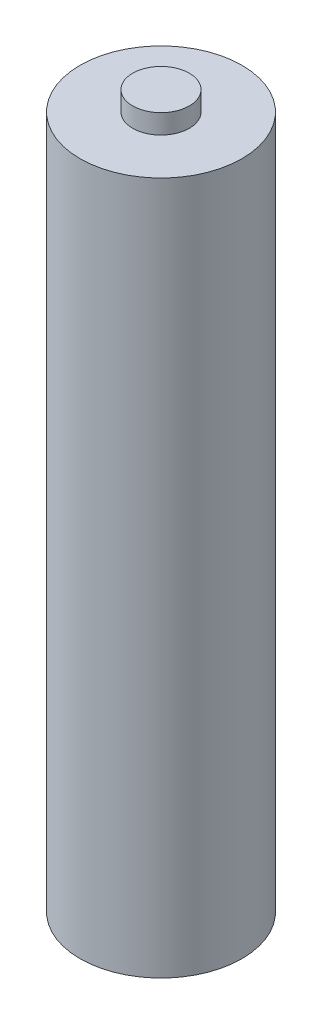
ISO-10303-21;
HEADER;
FILE_DESCRIPTION(('STEP AP214'),'2;1');
FILE_NAME('part.step','',(''),(''),'','','');
FILE_SCHEMA(('AUTOMOTIVE_DESIGN { 1 0 10303 214 1 1 1 1 }'));
ENDSEC;
DATA;
#1=APPLICATION_CONTEXT('core data for automotive mechanical design processes');
#2=APPLICATION_PROTOCOL_DEFINITION('international standard','automotive_design',2000,#1);
#3=PRODUCT_CONTEXT('',#1,'mechanical');
#4=PRODUCT('Part','Part','',(#3));
#5=PRODUCT_RELATED_PRODUCT_CATEGORY('part','',(#4));
#6=PRODUCT_DEFINITION_FORMATION('','',#4);
#7=PRODUCT_DEFINITION_CONTEXT('part definition',#1,'design');
#8=PRODUCT_DEFINITION('design','',#6,#7);
#9=PRODUCT_DEFINITION_SHAPE('','',#8);
#10=(LENGTH_UNIT() NAMED_UNIT(*) SI_UNIT(.MILLI.,.METRE.));
#11=(NAMED_UNIT(*) PLANE_ANGLE_UNIT() SI_UNIT($,.RADIAN.));
#12=(NAMED_UNIT(*) SI_UNIT($,.STERADIAN.) SOLID_ANGLE_UNIT());
#13=UNCERTAINTY_MEASURE_WITH_UNIT(LENGTH_MEASURE(1.E-05),#10,'distance_accuracy_value','');
#14=(GEOMETRIC_REPRESENTATION_CONTEXT(3) GLOBAL_UNCERTAINTY_ASSIGNED_CONTEXT((#13)) GLOBAL_UNIT_ASSIGNED_CONTEXT((#10,
#11,#12)) REPRESENTATION_CONTEXT('',''));
#15=CARTESIAN_POINT('',(0.,0.,0.));
#16=DIRECTION('',(0.,0.,1.));
#17=DIRECTION('',(1.,0.,0.));
#18=AXIS2_PLACEMENT_3D('',#15,#16,#17);
#19=CARTESIAN_POINT('',(0.,0.,0.));
#20=DIRECTION('',(0.,1.,0.));
#21=DIRECTION('',(0.,0.,1.));
#22=AXIS2_PLACEMENT_3D('',#19,#20,#21);
#23=PLANE('',#22);
#24=CARTESIAN_POINT('',(0.,0.,0.));
#25=DIRECTION('',(0.,1.,0.));
#26=DIRECTION('',(0.,0.,1.));
#27=AXIS2_PLACEMENT_3D('',#24,#25,#26);
#28=CIRCLE('',#27,1.75);
#29=CARTESIAN_POINT('',(0.,0.,1.75));
#30=VERTEX_POINT('',#29);
#31=EDGE_CURVE('E10',#30,#30,#28,.T.);
#32=ORIENTED_EDGE('',*,*,#31,.F.);
#33=EDGE_LOOP('',(#32));
#34=FACE_BOUND('',#33,.T.);
#35=CARTESIAN_POINT('',(0.,0.,0.));
#36=DIRECTION('',(0.,1.,0.));
#37=DIRECTION('',(0.,0.,1.));
#38=AXIS2_PLACEMENT_3D('',#35,#36,#37);
#39=CIRCLE('',#38,5.);
#40=CARTESIAN_POINT('',(0.,0.,5.));
#41=VERTEX_POINT('',#40);
#42=EDGE_CURVE('E41',#41,#41,#39,.T.);
#43=ORIENTED_EDGE('',*,*,#42,.T.);
#44=EDGE_LOOP('',(#43));
#45=FACE_BOUND('',#44,.T.);
#46=ADVANCED_FACE('F33',(#34,#45),#23,.T.);
#47=CARTESIAN_POINT('',(0.,0.,0.));
#48=DIRECTION('',(0.,1.,0.));
#49=DIRECTION('',(0.,0.,1.));
#50=AXIS2_PLACEMENT_3D('',#47,#48,#49);
#51=CYLINDRICAL_SURFACE('',#50,5.);
#52=CARTESIAN_POINT('',(0.,-42.8,0.));
#53=DIRECTION('',(0.,1.,0.));
#54=DIRECTION('',(0.,0.,1.));
#55=AXIS2_PLACEMENT_3D('',#52,#53,#54);
#56=CIRCLE('',#55,5.);
#57=CARTESIAN_POINT('',(0.,-42.8,4.99999999999999));
#58=VERTEX_POINT('',#57);
#59=EDGE_CURVE('E45',#58,#58,#56,.T.);
#60=ORIENTED_EDGE('',*,*,#59,.T.);
#61=EDGE_LOOP('',(#60));
#62=FACE_BOUND('',#61,.T.);
#63=ORIENTED_EDGE('',*,*,#42,.F.);
#64=EDGE_LOOP('',(#63));
#65=FACE_BOUND('',#64,.T.);
#66=ADVANCED_FACE('F63',(#62,#65),#51,.T.);
#67=CARTESIAN_POINT('',(0.,-42.8,0.));
#68=DIRECTION('',(0.,1.,0.));
#69=DIRECTION('',(0.,0.,1.));
#70=AXIS2_PLACEMENT_3D('',#67,#68,#69);
#71=PLANE('',#70);
#72=ORIENTED_EDGE('',*,*,#59,.F.);
#73=EDGE_LOOP('',(#72));
#74=FACE_BOUND('',#73,.T.);
#75=ADVANCED_FACE('F60',(#74),#71,.F.);
#76=CARTESIAN_POINT('',(0.,1.2,0.));
#77=DIRECTION('',(0.,1.,0.));
#78=DIRECTION('',(0.,0.,1.));
#79=AXIS2_PLACEMENT_3D('',#76,#77,#78);
#80=PLANE('',#79);
#81=CARTESIAN_POINT('',(0.,1.2,0.));
#82=DIRECTION('',(0.,1.,0.));
#83=DIRECTION('',(0.,0.,1.));
#84=AXIS2_PLACEMENT_3D('',#81,#82,#83);
#85=CIRCLE('',#84,1.75);
#86=CARTESIAN_POINT('',(0.,1.2,1.75));
#87=VERTEX_POINT('',#86);
#88=EDGE_CURVE('E37',#87,#87,#85,.T.);
#89=ORIENTED_EDGE('',*,*,#88,.T.);
#90=EDGE_LOOP('',(#89));
#91=FACE_BOUND('',#90,.T.);
#92=ADVANCED_FACE('F35',(#91),#80,.T.);
#93=CARTESIAN_POINT('',(0.,0.,0.));
#94=DIRECTION('',(0.,1.,0.));
#95=DIRECTION('',(0.,0.,1.));
#96=AXIS2_PLACEMENT_3D('',#93,#94,#95);
#97=CYLINDRICAL_SURFACE('',#96,1.75);
#98=ORIENTED_EDGE('',*,*,#88,.F.);
#99=EDGE_LOOP('',(#98));
#100=FACE_BOUND('',#99,.T.);
#101=ORIENTED_EDGE('',*,*,#31,.T.);
#102=EDGE_LOOP('',(#101));
#103=FACE_BOUND('',#102,.T.);
#104=ADVANCED_FACE('F55',(#100,#103),#97,.T.);
#105=CLOSED_SHELL('',(#46,#66,#75,#92,#104));
#106=MANIFOLD_SOLID_BREP('B2',#105);
#107=ADVANCED_BREP_SHAPE_REPRESENTATION('',(#18,#106),#14);
#108=SHAPE_DEFINITION_REPRESENTATION(#9,#107);
ENDSEC;
END-ISO-10303-21;
